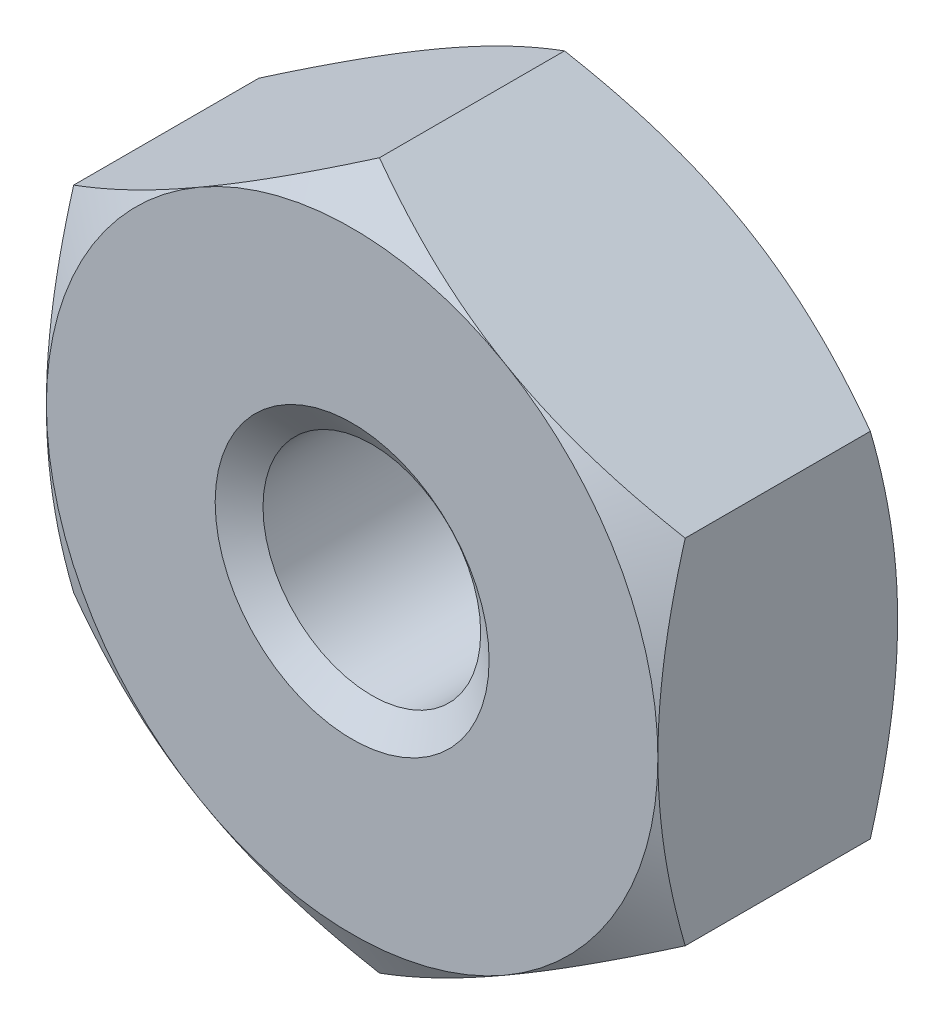
ISO-10303-21;
HEADER;
FILE_DESCRIPTION(('STEP AP214'),'2;1');
FILE_NAME('part.step','',(''),(''),'','','');
FILE_SCHEMA(('AUTOMOTIVE_DESIGN { 1 0 10303 214 1 1 1 1 }'));
ENDSEC;
DATA;
#1=APPLICATION_CONTEXT('core data for automotive mechanical design processes');
#2=APPLICATION_PROTOCOL_DEFINITION('international standard','automotive_design',2000,#1);
#3=PRODUCT_CONTEXT('',#1,'mechanical');
#4=PRODUCT('Part','Part','',(#3));
#5=PRODUCT_RELATED_PRODUCT_CATEGORY('part','',(#4));
#6=PRODUCT_DEFINITION_FORMATION('','',#4);
#7=PRODUCT_DEFINITION_CONTEXT('part definition',#1,'design');
#8=PRODUCT_DEFINITION('design','',#6,#7);
#9=PRODUCT_DEFINITION_SHAPE('','',#8);
#10=(LENGTH_UNIT() NAMED_UNIT(*) SI_UNIT(.MILLI.,.METRE.));
#11=(NAMED_UNIT(*) PLANE_ANGLE_UNIT() SI_UNIT($,.RADIAN.));
#12=(NAMED_UNIT(*) SI_UNIT($,.STERADIAN.) SOLID_ANGLE_UNIT());
#13=UNCERTAINTY_MEASURE_WITH_UNIT(LENGTH_MEASURE(1.E-05),#10,'distance_accuracy_value','');
#14=(GEOMETRIC_REPRESENTATION_CONTEXT(3) GLOBAL_UNCERTAINTY_ASSIGNED_CONTEXT((#13)) GLOBAL_UNIT_ASSIGNED_CONTEXT((#10,
#11,#12)) REPRESENTATION_CONTEXT('',''));
#15=CARTESIAN_POINT('',(0.,0.,0.));
#16=DIRECTION('',(0.,0.,1.));
#17=DIRECTION('',(1.,0.,0.));
#18=AXIS2_PLACEMENT_3D('',#15,#16,#17);
#19=CARTESIAN_POINT('',(0.,0.,-2.4892));
#20=DIRECTION('',(0.,0.,1.));
#21=DIRECTION('',(1.,0.,0.));
#22=AXIS2_PLACEMENT_3D('',#19,#20,#21);
#23=CYLINDRICAL_SURFACE('',#22,1.1303);
#24=CARTESIAN_POINT('',(0.,0.,-0.204530621911055));
#25=DIRECTION('',(0.,0.,1.));
#26=DIRECTION('',(1.,0.,0.));
#27=AXIS2_PLACEMENT_3D('',#24,#25,#26);
#28=CIRCLE('',#27,1.1303);
#29=CARTESIAN_POINT('',(1.1303,0.,-0.204530621911055));
#30=VERTEX_POINT('',#29);
#31=EDGE_CURVE('E178',#30,#30,#28,.F.);
#32=ORIENTED_EDGE('',*,*,#31,.F.);
#33=EDGE_LOOP('',(#32));
#34=FACE_BOUND('',#33,.T.);
#35=CARTESIAN_POINT('',(0.,0.,-2.25926937808894));
#36=DIRECTION('',(0.,0.,-1.));
#37=DIRECTION('',(-1.,0.,0.));
#38=AXIS2_PLACEMENT_3D('',#35,#36,#37);
#39=CIRCLE('',#38,1.1303);
#40=CARTESIAN_POINT('',(-1.1303,0.,-2.25926937808894));
#41=VERTEX_POINT('',#40);
#42=EDGE_CURVE('E43',#41,#41,#39,.F.);
#43=ORIENTED_EDGE('',*,*,#42,.F.);
#44=EDGE_LOOP('',(#43));
#45=FACE_BOUND('',#44,.T.);
#46=ADVANCED_FACE('F38',(#34,#45),#23,.F.);
#47=CARTESIAN_POINT('',(0.,3.66617420935413,-2.4892));
#48=DIRECTION('',(0.,0.,-1.));
#49=DIRECTION('',(-1.,0.,0.));
#50=AXIS2_PLACEMENT_3D('',#47,#48,#49);
#51=PLANE('',#50);
#52=CARTESIAN_POINT('',(0.,0.,-2.4892));
#53=DIRECTION('',(0.,0.,-1.));
#54=DIRECTION('',(-1.,0.,0.));
#55=AXIS2_PLACEMENT_3D('',#52,#53,#54);
#56=CIRCLE('',#55,3.175);
#57=CARTESIAN_POINT('',(-3.175,0.,-2.4892));
#58=VERTEX_POINT('',#57);
#59=CARTESIAN_POINT('',(-1.5875,-2.74963065701559,-2.4892));
#60=VERTEX_POINT('',#59);
#61=EDGE_CURVE('E174',#58,#60,#56,.F.);
#62=ORIENTED_EDGE('',*,*,#61,.F.);
#63=CARTESIAN_POINT('',(-1.58750000000001,2.74963065701559,-2.4892));
#64=VERTEX_POINT('',#63);
#65=EDGE_CURVE('E156',#64,#58,#56,.F.);
#66=ORIENTED_EDGE('',*,*,#65,.F.);
#67=CARTESIAN_POINT('',(1.5875,2.74963065701559,-2.4892));
#68=VERTEX_POINT('',#67);
#69=EDGE_CURVE('E173',#68,#64,#56,.F.);
#70=ORIENTED_EDGE('',*,*,#69,.F.);
#71=CARTESIAN_POINT('',(0.,0.,-2.4892));
#72=DIRECTION('',(0.,0.,1.));
#73=DIRECTION('',(1.,0.,0.));
#74=AXIS2_PLACEMENT_3D('',#71,#72,#73);
#75=CIRCLE('',#74,3.175);
#76=CARTESIAN_POINT('',(3.175,0.,-2.4892));
#77=VERTEX_POINT('',#76);
#78=EDGE_CURVE('E248',#77,#68,#75,.T.);
#79=ORIENTED_EDGE('',*,*,#78,.F.);
#80=CARTESIAN_POINT('',(1.58750000000001,-2.74963065701559,-2.4892));
#81=VERTEX_POINT('',#80);
#82=EDGE_CURVE('E380',#81,#77,#56,.F.);
#83=ORIENTED_EDGE('',*,*,#82,.F.);
#84=EDGE_CURVE('E401',#60,#81,#56,.F.);
#85=ORIENTED_EDGE('',*,*,#84,.F.);
#86=EDGE_LOOP('',(#62,#66,#70,#79,#83,#85));
#87=FACE_BOUND('',#86,.T.);
#88=CARTESIAN_POINT('',(0.,0.,-2.4892));
#89=DIRECTION('',(0.,0.,-1.));
#90=DIRECTION('',(-1.,0.,0.));
#91=AXIS2_PLACEMENT_3D('',#88,#89,#90);
#92=CIRCLE('',#91,1.4224);
#93=CARTESIAN_POINT('',(-1.4224,0.,-2.4892));
#94=VERTEX_POINT('',#93);
#95=EDGE_CURVE('E181',#94,#94,#92,.F.);
#96=ORIENTED_EDGE('',*,*,#95,.T.);
#97=EDGE_LOOP('',(#96));
#98=FACE_BOUND('',#97,.T.);
#99=ADVANCED_FACE('F253',(#87,#98),#51,.T.);
#100=CARTESIAN_POINT('',(0.,3.66617420935413,0.));
#101=DIRECTION('',(0.,0.,-1.));
#102=DIRECTION('',(-1.,0.,0.));
#103=AXIS2_PLACEMENT_3D('',#100,#101,#102);
#104=PLANE('',#103);
#105=CARTESIAN_POINT('',(0.,0.,0.));
#106=DIRECTION('',(0.,0.,-1.));
#107=DIRECTION('',(-1.,0.,0.));
#108=AXIS2_PLACEMENT_3D('',#105,#106,#107);
#109=CIRCLE('',#108,3.175);
#110=CARTESIAN_POINT('',(-3.175,0.,0.));
#111=VERTEX_POINT('',#110);
#112=CARTESIAN_POINT('',(-1.58750000000001,2.74963065701559,0.));
#113=VERTEX_POINT('',#112);
#114=EDGE_CURVE('E11',#111,#113,#109,.T.);
#115=ORIENTED_EDGE('',*,*,#114,.F.);
#116=CARTESIAN_POINT('',(-1.5875,-2.74963065701559,0.));
#117=VERTEX_POINT('',#116);
#118=EDGE_CURVE('E50',#117,#111,#109,.T.);
#119=ORIENTED_EDGE('',*,*,#118,.F.);
#120=CARTESIAN_POINT('',(1.58750000000001,-2.74963065701559,0.));
#121=VERTEX_POINT('',#120);
#122=EDGE_CURVE('E177',#121,#117,#109,.T.);
#123=ORIENTED_EDGE('',*,*,#122,.F.);
#124=CARTESIAN_POINT('',(3.175,0.,0.));
#125=VERTEX_POINT('',#124);
#126=EDGE_CURVE('E346',#125,#121,#109,.T.);
#127=ORIENTED_EDGE('',*,*,#126,.F.);
#128=CARTESIAN_POINT('',(0.,0.,0.));
#129=DIRECTION('',(0.,0.,1.));
#130=DIRECTION('',(1.,0.,0.));
#131=AXIS2_PLACEMENT_3D('',#128,#129,#130);
#132=CIRCLE('',#131,3.175);
#133=CARTESIAN_POINT('',(1.5875,2.74963065701559,0.));
#134=VERTEX_POINT('',#133);
#135=EDGE_CURVE('E132',#125,#134,#132,.T.);
#136=ORIENTED_EDGE('',*,*,#135,.T.);
#137=EDGE_CURVE('E48',#113,#134,#109,.T.);
#138=ORIENTED_EDGE('',*,*,#137,.F.);
#139=EDGE_LOOP('',(#115,#119,#123,#127,#136,#138));
#140=FACE_BOUND('',#139,.T.);
#141=CARTESIAN_POINT('',(0.,0.,0.));
#142=DIRECTION('',(0.,0.,1.));
#143=DIRECTION('',(1.,0.,0.));
#144=AXIS2_PLACEMENT_3D('',#141,#142,#143);
#145=CIRCLE('',#144,1.4224);
#146=CARTESIAN_POINT('',(1.4224,0.,0.));
#147=VERTEX_POINT('',#146);
#148=EDGE_CURVE('E180',#147,#147,#145,.T.);
#149=ORIENTED_EDGE('',*,*,#148,.F.);
#150=EDGE_LOOP('',(#149));
#151=FACE_BOUND('',#150,.T.);
#152=ADVANCED_FACE('F305',(#140,#151),#104,.F.);
#153=CARTESIAN_POINT('',(0.,3.66617420935413,-2.4892));
#154=DIRECTION('',(-0.500000000000003,0.866025403784437,0.));
#155=DIRECTION('',(-0.866025403784437,-0.500000000000003,0.));
#156=AXIS2_PLACEMENT_3D('',#153,#154,#155);
#157=PLANE('',#156);
#158=DIRECTION('',(0.,0.,1.));
#159=VECTOR('',#158,1.);
#160=CARTESIAN_POINT('',(-3.175,1.83308710467705,-2.4892));
#161=LINE('',#160,#159);
#162=CARTESIAN_POINT('',(-3.175,1.83308710467707,-2.20562043801039));
#163=VERTEX_POINT('',#162);
#164=CARTESIAN_POINT('',(-3.175,1.83308710467705,-0.283579561989604));
#165=VERTEX_POINT('',#164);
#166=EDGE_CURVE('E168',#163,#165,#161,.T.);
#167=ORIENTED_EDGE('',*,*,#166,.T.);
#168=CARTESIAN_POINT('',(-3.1752,1.83297163462322,-0.283646231805777));
#169=CARTESIAN_POINT('',(-3.03567460326018,1.91352665998974,-0.237119934023206));
#170=CARTESIAN_POINT('',(-2.89494483272887,1.99477703088899,-0.194805864908322));
#171=CARTESIAN_POINT('',(-2.61104837470026,2.15868472735379,-0.120946008708286));
#172=CARTESIAN_POINT('',(-2.46787664251628,2.24134496547055,-0.0894263509090417));
#173=CARTESIAN_POINT('',(-2.18330753500984,2.40564101629245,-0.0403611049832706));
#174=CARTESIAN_POINT('',(-2.0419539457708,2.48725154909053,-0.0224889669031259));
#175=CARTESIAN_POINT('',(-1.7585816022433,2.65085664790703,-0.00115281403229668));
#176=CARTESIAN_POINT('',(-1.61656387803407,2.73285061920892,0.00232886836810178));
#177=CARTESIAN_POINT('',(-1.35119263453263,2.88606277807967,-0.0049117007222132));
#178=CARTESIAN_POINT('',(-1.22779940341379,2.95730389328231,-0.0138561461436312));
#179=CARTESIAN_POINT('',(-0.981816852669884,3.09932198517026,-0.0422055763684448));
#180=CARTESIAN_POINT('',(-0.859228383940738,3.17009847059057,-0.0616202467099072));
#181=CARTESIAN_POINT('',(-0.612738605574498,3.31240941048281,-0.110155730811224));
#182=CARTESIAN_POINT('',(-0.488868495421443,3.38392585192423,-0.139482298472807));
#183=CARTESIAN_POINT('',(-0.242975839646996,3.52589204292736,-0.206042193662161));
#184=CARTESIAN_POINT('',(-0.120950143425915,3.59634361148865,-0.243259880449917));
#185=CARTESIAN_POINT('',(0.000199999999997795,3.66628967940797,-0.283646231805782));
#186=B_SPLINE_CURVE_WITH_KNOTS('',3,(#168,#169,#170,#171,#172,#173,#174,#175,#176,#177,#178,
#179,#180,#181,#182,#183,#184,#185),.UNSPECIFIED.,.F.,.F.,(4,2,2,2,2,2,2,2,4),(0.,
0.503278731073368,1.00776724301492,1.49976968502821,1.99116790059651,2.41904879402149,
2.84732618162394,3.28510386250598,3.72202181665389),.UNSPECIFIED.);
#187=EDGE_CURVE('E137',#165,#113,#186,.T.);
#188=ORIENTED_EDGE('',*,*,#187,.T.);
#189=CARTESIAN_POINT('',(0.,3.66617420935413,-0.283579561989608));
#190=VERTEX_POINT('',#189);
#191=EDGE_CURVE('E57',#113,#190,#186,.T.);
#192=ORIENTED_EDGE('',*,*,#191,.T.);
#193=DIRECTION('',(0.,0.,1.));
#194=VECTOR('',#193,1.);
#195=CARTESIAN_POINT('',(0.,3.66617420935413,-2.4892));
#196=LINE('',#195,#194);
#197=CARTESIAN_POINT('',(0.,3.66617420935413,-2.20562043801039));
#198=VERTEX_POINT('',#197);
#199=EDGE_CURVE('E153',#198,#190,#196,.T.);
#200=ORIENTED_EDGE('',*,*,#199,.F.);
#201=CARTESIAN_POINT('',(-3.1752,1.83297163462322,-2.20555376819422));
#202=CARTESIAN_POINT('',(-3.03567460326018,1.91352665998974,-2.25208006597679));
#203=CARTESIAN_POINT('',(-2.89494483272887,1.99477703088899,-2.29439413509168));
#204=CARTESIAN_POINT('',(-2.61104837470026,2.15868472735379,-2.36825399129171));
#205=CARTESIAN_POINT('',(-2.46787664251628,2.24134496547055,-2.39977364909096));
#206=CARTESIAN_POINT('',(-2.18330753500984,2.40564101629245,-2.44883889501673));
#207=CARTESIAN_POINT('',(-2.0419539457708,2.48725154909053,-2.46671103309687));
#208=CARTESIAN_POINT('',(-1.7585816022433,2.65085664790703,-2.4880471859677));
#209=CARTESIAN_POINT('',(-1.61656387803408,2.73285061920892,-2.4915288683681));
#210=CARTESIAN_POINT('',(-1.35119263453263,2.88606277807967,-2.48428829927779));
#211=CARTESIAN_POINT('',(-1.22779940341379,2.95730389328231,-2.47534385385637));
#212=CARTESIAN_POINT('',(-0.981816852669885,3.09932198517026,-2.44699442363156));
#213=CARTESIAN_POINT('',(-0.859228383940739,3.17009847059057,-2.42757975329009));
#214=CARTESIAN_POINT('',(-0.612738605574499,3.31240941048281,-2.37904426918878));
#215=CARTESIAN_POINT('',(-0.488868495421443,3.38392585192423,-2.34971770152719));
#216=CARTESIAN_POINT('',(-0.242975839646997,3.52589204292736,-2.28315780633784));
#217=CARTESIAN_POINT('',(-0.120950143425915,3.59634361148865,-2.24594011955008));
#218=CARTESIAN_POINT('',(0.000199999999997508,3.66628967940797,-2.20555376819422));
#219=B_SPLINE_CURVE_WITH_KNOTS('',3,(#201,#202,#203,#204,#205,#206,#207,#208,#209,#210,#211,
#212,#213,#214,#215,#216,#217,#218),.UNSPECIFIED.,.F.,.F.,(4,2,2,2,2,2,2,2,4),(0.,
0.503278731073368,1.00776724301492,1.49976968502821,1.99116790059651,2.41904879402149,
2.84732618162394,3.28510386250597,3.72202181665389),.UNSPECIFIED.);
#220=EDGE_CURVE('E171',#64,#198,#219,.T.);
#221=ORIENTED_EDGE('',*,*,#220,.F.);
#222=EDGE_CURVE('E263',#163,#64,#219,.T.);
#223=ORIENTED_EDGE('',*,*,#222,.F.);
#224=EDGE_LOOP('',(#167,#188,#192,#200,#221,#223));
#225=FACE_BOUND('',#224,.T.);
#226=ADVANCED_FACE('F40',(#225),#157,.T.);
#227=CARTESIAN_POINT('',(3.175,1.83308710467706,-2.4892));
#228=DIRECTION('',(0.500000000000001,0.866025403784438,0.));
#229=DIRECTION('',(-0.866025403784438,0.500000000000001,0.));
#230=AXIS2_PLACEMENT_3D('',#227,#228,#229);
#231=PLANE('',#230);
#232=ORIENTED_EDGE('',*,*,#199,.T.);
#233=CARTESIAN_POINT('',(-0.000200000000002592,3.66628967940797,-0.283646231805782));
#234=CARTESIAN_POINT('',(0.139325396739816,3.58573465404144,-0.237119934023211));
#235=CARTESIAN_POINT('',(0.280055167271126,3.5044842831422,-0.194805864908326));
#236=CARTESIAN_POINT('',(0.56395162529974,3.34057658667739,-0.120946008708289));
#237=CARTESIAN_POINT('',(0.707123357483716,3.25791634856063,-0.0894263509090447));
#238=CARTESIAN_POINT('',(0.991692464990165,3.09362029773873,-0.0403611049832727));
#239=CARTESIAN_POINT('',(1.1330460542292,3.01200976494065,-0.0224889669031276));
#240=CARTESIAN_POINT('',(1.41641839775671,2.84840466612415,-0.00115281403229755));
#241=CARTESIAN_POINT('',(1.55843612196593,2.76641069482226,0.00232886836810127));
#242=CARTESIAN_POINT('',(1.82380736546737,2.61319853595151,-0.00491170072221298));
#243=CARTESIAN_POINT('',(1.94720059658621,2.54195742074887,-0.0138561461436305));
#244=CARTESIAN_POINT('',(2.19318314733012,2.39993932886093,-0.0422055763684434));
#245=CARTESIAN_POINT('',(2.31577161605926,2.32916284344061,-0.0616202467099056));
#246=CARTESIAN_POINT('',(2.5622613944255,2.18685190354837,-0.110155730811222));
#247=CARTESIAN_POINT('',(2.68613150457856,2.11533546210696,-0.139482298472804));
#248=CARTESIAN_POINT('',(2.932024160353,1.97336927110383,-0.206042193662157));
#249=CARTESIAN_POINT('',(3.05404985657409,1.90291770254253,-0.243259880449913));
#250=CARTESIAN_POINT('',(3.1752,1.83297163462322,-0.283646231805778));
#251=B_SPLINE_CURVE_WITH_KNOTS('',3,(#233,#234,#235,#236,#237,#238,#239,#240,#241,#242,#243,
#244,#245,#246,#247,#248,#249,#250),.UNSPECIFIED.,.F.,.F.,(4,2,2,2,2,2,2,2,4),(0.,
0.503278731073369,1.00776724301492,1.49976968502821,1.99116790059651,2.41904879402149,
2.84732618162394,3.28510386250598,3.72202181665389),.UNSPECIFIED.);
#252=EDGE_CURVE('E147',#190,#134,#251,.T.);
#253=ORIENTED_EDGE('',*,*,#252,.T.);
#254=CARTESIAN_POINT('',(3.175,1.83308710467707,-0.283579561989608));
#255=VERTEX_POINT('',#254);
#256=EDGE_CURVE('E64',#134,#255,#251,.T.);
#257=ORIENTED_EDGE('',*,*,#256,.T.);
#258=DIRECTION('',(0.,0.,1.));
#259=VECTOR('',#258,1.);
#260=CARTESIAN_POINT('',(3.175,1.83308710467706,-2.4892));
#261=LINE('',#260,#259);
#262=CARTESIAN_POINT('',(3.175,1.83308710467707,-2.20562043801039));
#263=VERTEX_POINT('',#262);
#264=EDGE_CURVE('E146',#263,#255,#261,.T.);
#265=ORIENTED_EDGE('',*,*,#264,.F.);
#266=CARTESIAN_POINT('',(-0.000200000000002578,3.66628967940797,-2.20555376819422));
#267=CARTESIAN_POINT('',(0.139325396739816,3.58573465404144,-2.25208006597679));
#268=CARTESIAN_POINT('',(0.280055167271126,3.5044842831422,-2.29439413509167));
#269=CARTESIAN_POINT('',(0.56395162529974,3.34057658667739,-2.36825399129171));
#270=CARTESIAN_POINT('',(0.707123357483716,3.25791634856063,-2.39977364909096));
#271=CARTESIAN_POINT('',(0.991692464990165,3.09362029773873,-2.44883889501673));
#272=CARTESIAN_POINT('',(1.1330460542292,3.01200976494066,-2.46671103309687));
#273=CARTESIAN_POINT('',(1.4164183977567,2.84840466612415,-2.4880471859677));
#274=CARTESIAN_POINT('',(1.55843612196593,2.76641069482226,-2.4915288683681));
#275=CARTESIAN_POINT('',(1.82380736546737,2.61319853595151,-2.48428829927779));
#276=CARTESIAN_POINT('',(1.94720059658621,2.54195742074887,-2.47534385385637));
#277=CARTESIAN_POINT('',(2.19318314733012,2.39993932886093,-2.44699442363156));
#278=CARTESIAN_POINT('',(2.31577161605926,2.32916284344061,-2.42757975329009));
#279=CARTESIAN_POINT('',(2.5622613944255,2.18685190354837,-2.37904426918878));
#280=CARTESIAN_POINT('',(2.68613150457856,2.11533546210696,-2.3497177015272));
#281=CARTESIAN_POINT('',(2.932024160353,1.97336927110383,-2.28315780633784));
#282=CARTESIAN_POINT('',(3.05404985657409,1.90291770254253,-2.24594011955009));
#283=CARTESIAN_POINT('',(3.1752,1.83297163462322,-2.20555376819422));
#284=B_SPLINE_CURVE_WITH_KNOTS('',3,(#266,#267,#268,#269,#270,#271,#272,#273,#274,#275,#276,
#277,#278,#279,#280,#281,#282,#283),.UNSPECIFIED.,.F.,.F.,(4,2,2,2,2,2,2,2,4),(0.,
0.503278731073369,1.00776724301492,1.49976968502821,1.99116790059651,2.41904879402149,
2.84732618162394,3.28510386250597,3.72202181665389),.UNSPECIFIED.);
#285=EDGE_CURVE('E257',#68,#263,#284,.T.);
#286=ORIENTED_EDGE('',*,*,#285,.F.);
#287=EDGE_CURVE('E262',#198,#68,#284,.T.);
#288=ORIENTED_EDGE('',*,*,#287,.F.);
#289=EDGE_LOOP('',(#232,#253,#257,#265,#286,#288));
#290=FACE_BOUND('',#289,.T.);
#291=ADVANCED_FACE('F144',(#290),#231,.T.);
#292=CARTESIAN_POINT('',(3.175,1.83308710467706,-2.4892));
#293=DIRECTION('',(-1.,0.,0.));
#294=DIRECTION('',(0.,0.,1.));
#295=AXIS2_PLACEMENT_3D('',#292,#293,#294);
#296=PLANE('',#295);
#297=CARTESIAN_POINT('',(3.175,-4.8616171420299,-1.51932228935976));
#298=CARTESIAN_POINT('',(3.175,-4.72221668774449,-1.45195628992123));
#299=CARTESIAN_POINT('',(3.175,-4.58248664475634,-1.38525996427212));
#300=CARTESIAN_POINT('',(3.175,-4.30218917292502,-1.25358933527025));
#301=CARTESIAN_POINT('',(3.175,-4.16162160419068,-1.18861533006649));
#302=CARTESIAN_POINT('',(3.175,-3.87871153776028,-1.06042973005273));
#303=CARTESIAN_POINT('',(3.175,-3.73636348618431,-0.997230348581289));
#304=CARTESIAN_POINT('',(3.175,-3.4504974070564,-0.873546152177363));
#305=CARTESIAN_POINT('',(3.175,-3.30697944095183,-0.813061195746994));
#306=CARTESIAN_POINT('',(3.175,-3.01676360978826,-0.694809578750527));
#307=CARTESIAN_POINT('',(3.175,-2.87004833678074,-0.637085406846329));
#308=CARTESIAN_POINT('',(3.175,-2.57488727143506,-0.52615800832404));
#309=CARTESIAN_POINT('',(3.175,-2.42644128864792,-0.472955284693414));
#310=CARTESIAN_POINT('',(3.175,-2.12788752613931,-0.372500325317013));
#311=CARTESIAN_POINT('',(3.175,-1.97778404697074,-0.325235438859671));
#312=CARTESIAN_POINT('',(3.175,-1.67544317117207,-0.238191164257202));
#313=CARTESIAN_POINT('',(3.175,-1.52320646578688,-0.198409408930922));
#314=CARTESIAN_POINT('',(3.175,-1.21649515954196,-0.12826269349477));
#315=CARTESIAN_POINT('',(3.175,-1.06201997425122,-0.0979002407280034));
#316=CARTESIAN_POINT('',(3.175,-0.751207163661342,-0.0486364247633595));
#317=CARTESIAN_POINT('',(3.175,-0.594869536715698,-0.0297350716985354));
#318=CARTESIAN_POINT('',(3.175,-0.282140016767182,-0.00506556418736419));
#319=CARTESIAN_POINT('',(3.175,-0.125754853180874,0.000785733729077507));
#320=CARTESIAN_POINT('',(3.175,0.186905967950925,-0.000955727684993067));
#321=CARTESIAN_POINT('',(3.175,0.34318164338531,-0.00854499720968375));
#322=CARTESIAN_POINT('',(3.175,0.61004500421025,-0.0324474955995366));
#323=CARTESIAN_POINT('',(3.175,0.720927103340566,-0.0456480037348523));
#324=CARTESIAN_POINT('',(3.175,0.941834770691505,-0.0779568944626853));
#325=CARTESIAN_POINT('',(3.175,1.05186020102054,-0.0970662087901405));
#326=CARTESIAN_POINT('',(3.175,1.38056179828294,-0.162254462566744));
#327=CARTESIAN_POINT('',(3.175,1.59769723107173,-0.216176928599964));
#328=CARTESIAN_POINT('',(3.175,1.92260738330278,-0.309178610208029));
#329=CARTESIAN_POINT('',(3.175,2.03207569486971,-0.342672941312984));
#330=CARTESIAN_POINT('',(3.175,2.24986976286739,-0.412975885555784));
#331=CARTESIAN_POINT('',(3.175,2.35819625057448,-0.44978221272336));
#332=CARTESIAN_POINT('',(3.175,2.57325368409845,-0.52594327372435));
#333=CARTESIAN_POINT('',(3.175,2.67999017870302,-0.565282497316839));
#334=CARTESIAN_POINT('',(3.175,2.89263503540125,-0.646269943321368));
#335=CARTESIAN_POINT('',(3.175,2.99854304277513,-0.687919098952172));
#336=CARTESIAN_POINT('',(3.175,3.1040681107068,-0.730495273942545));
#337=B_SPLINE_CURVE_WITH_KNOTS('',3,(#297,#298,#299,#300,#301,#302,#303,#304,#305,#306,#307,
#308,#309,#310,#311,#312,#313,#314,#315,#316,#317,#318,#319,#320,#321,#322,#323,#324,#325,#326,
#327,#328,#329,#330,#331,#332,#333,#334,#335,#336),.UNSPECIFIED.,.F.,.F.,(4,2,2,2,2,2,2,2,2,2,2,
2,2,2,2,2,2,2,2,4),(0.,0.46448011032249,0.929040108038168,1.39625859500254,1.86345269838581,
2.33638249541752,2.80936483473484,3.2813217385372,3.7531290935448,4.22506193235102,
4.69699518840458,5.16591300646641,5.63470908917535,5.96954086780257,6.30442547160104,
6.97469308766864,7.3180994250629,7.66127053211061,8.00251004161232,8.34388843151021),.UNSPECIFIED.);
#338=CARTESIAN_POINT('',(3.175,-1.83308710467707,-0.283579561989608));
#339=VERTEX_POINT('',#338);
#340=EDGE_CURVE('E139',#339,#125,#337,.T.);
#341=ORIENTED_EDGE('',*,*,#340,.F.);
#342=DIRECTION('',(0.,0.,1.));
#343=VECTOR('',#342,1.);
#344=CARTESIAN_POINT('',(3.175,-1.83308710467707,-2.4892));
#345=LINE('',#344,#343);
#346=CARTESIAN_POINT('',(3.175,-1.83308710467707,-2.20562043801039));
#347=VERTEX_POINT('',#346);
#348=EDGE_CURVE('E154',#347,#339,#345,.T.);
#349=ORIENTED_EDGE('',*,*,#348,.F.);
#350=CARTESIAN_POINT('',(3.175,-4.86161714202989,-0.969877710640244));
#351=CARTESIAN_POINT('',(3.175,-4.72221668774449,-1.03724371007878));
#352=CARTESIAN_POINT('',(3.175,-4.58248664475633,-1.10394003572788));
#353=CARTESIAN_POINT('',(3.175,-4.30218917292502,-1.23561066472975));
#354=CARTESIAN_POINT('',(3.175,-4.16162160419068,-1.30058466993351));
#355=CARTESIAN_POINT('',(3.175,-3.87871153776028,-1.42877026994727));
#356=CARTESIAN_POINT('',(3.175,-3.73636348618431,-1.49196965141871));
#357=CARTESIAN_POINT('',(3.175,-3.4504974070564,-1.61565384782264));
#358=CARTESIAN_POINT('',(3.175,-3.30697944095183,-1.67613880425301));
#359=CARTESIAN_POINT('',(3.175,-3.01676360978826,-1.79439042124948));
#360=CARTESIAN_POINT('',(3.175,-2.87004833678074,-1.85211459315367));
#361=CARTESIAN_POINT('',(3.175,-2.57488727143506,-1.96304199167596));
#362=CARTESIAN_POINT('',(3.175,-2.42644128864792,-2.01624471530659));
#363=CARTESIAN_POINT('',(3.175,-2.12788752613931,-2.11669967468299));
#364=CARTESIAN_POINT('',(3.175,-1.97778404697074,-2.16396456114033));
#365=CARTESIAN_POINT('',(3.175,-1.67544317117207,-2.2510088357428));
#366=CARTESIAN_POINT('',(3.175,-1.52320646578688,-2.29079059106908));
#367=CARTESIAN_POINT('',(3.175,-1.21649515954197,-2.36093730650523));
#368=CARTESIAN_POINT('',(3.175,-1.06201997425122,-2.391299759272));
#369=CARTESIAN_POINT('',(3.175,-0.751207163661344,-2.44056357523664));
#370=CARTESIAN_POINT('',(3.175,-0.5948695367157,-2.45946492830147));
#371=CARTESIAN_POINT('',(3.175,-0.282140016767183,-2.48413443581264));
#372=CARTESIAN_POINT('',(3.175,-0.125754853180875,-2.48998573372908));
#373=CARTESIAN_POINT('',(3.175,0.186905967950924,-2.48824427231501));
#374=CARTESIAN_POINT('',(3.175,0.343181643385309,-2.48065500279032));
#375=CARTESIAN_POINT('',(3.175,0.61004500421025,-2.45675250440046));
#376=CARTESIAN_POINT('',(3.175,0.720927103340565,-2.44355199626515));
#377=CARTESIAN_POINT('',(3.175,0.941834770691505,-2.41124310553732));
#378=CARTESIAN_POINT('',(3.175,1.05186020102054,-2.39213379120986));
#379=CARTESIAN_POINT('',(3.175,1.38056179828294,-2.32694553743326));
#380=CARTESIAN_POINT('',(3.175,1.59769723107173,-2.27302307140004));
#381=CARTESIAN_POINT('',(3.175,1.92260738330278,-2.18002138979197));
#382=CARTESIAN_POINT('',(3.175,2.03207569486971,-2.14652705868702));
#383=CARTESIAN_POINT('',(3.175,2.24986976286739,-2.07622411444422));
#384=CARTESIAN_POINT('',(3.175,2.35819625057448,-2.03941778727664));
#385=CARTESIAN_POINT('',(3.175,2.57325368409845,-1.96325672627565));
#386=CARTESIAN_POINT('',(3.175,2.67999017870302,-1.92391750268316));
#387=CARTESIAN_POINT('',(3.175,2.89263503540125,-1.84293005667863));
#388=CARTESIAN_POINT('',(3.175,2.99854304277513,-1.80128090104783));
#389=CARTESIAN_POINT('',(3.175,3.1040681107068,-1.75870472605745));
#390=B_SPLINE_CURVE_WITH_KNOTS('',3,(#350,#351,#352,#353,#354,#355,#356,#357,#358,#359,#360,
#361,#362,#363,#364,#365,#366,#367,#368,#369,#370,#371,#372,#373,#374,#375,#376,#377,#378,#379,
#380,#381,#382,#383,#384,#385,#386,#387,#388,#389),.UNSPECIFIED.,.F.,.F.,(4,2,2,2,2,2,2,2,2,2,2,
2,2,2,2,2,2,2,2,4),(0.,0.464480110322489,0.929040108038167,1.39625859500254,1.86345269838581,
2.33638249541752,2.80936483473484,3.2813217385372,3.7531290935448,4.22506193235102,
4.69699518840457,5.16591300646641,5.63470908917534,5.96954086780257,6.30442547160103,
6.97469308766864,7.3180994250629,7.66127053211061,8.00251004161232,8.34388843151022),.UNSPECIFIED.);
#391=EDGE_CURVE('E269',#347,#77,#390,.T.);
#392=ORIENTED_EDGE('',*,*,#391,.T.);
#393=EDGE_CURVE('E152',#77,#263,#390,.T.);
#394=ORIENTED_EDGE('',*,*,#393,.T.);
#395=ORIENTED_EDGE('',*,*,#264,.T.);
#396=EDGE_CURVE('E129',#125,#255,#337,.T.);
#397=ORIENTED_EDGE('',*,*,#396,.F.);
#398=EDGE_LOOP('',(#341,#349,#392,#394,#395,#397));
#399=FACE_BOUND('',#398,.T.);
#400=ADVANCED_FACE('F150',(#399),#296,.F.);
#401=CARTESIAN_POINT('',(0.,-3.66617420935414,-2.4892));
#402=DIRECTION('',(0.500000000000003,-0.866025403784437,0.));
#403=DIRECTION('',(0.866025403784437,0.500000000000003,0.));
#404=AXIS2_PLACEMENT_3D('',#401,#402,#403);
#405=PLANE('',#404);
#406=ORIENTED_EDGE('',*,*,#348,.T.);
#407=CARTESIAN_POINT('',(3.1752,-1.83297163462323,-0.283646231805781));
#408=CARTESIAN_POINT('',(3.03567460326018,-1.91352665998975,-0.23711993402321));
#409=CARTESIAN_POINT('',(2.89494483272887,-1.994777030889,-0.194805864908325));
#410=CARTESIAN_POINT('',(2.61104837470026,-2.1586847273538,-0.12094600870829));
#411=CARTESIAN_POINT('',(2.46787664251628,-2.24134496547057,-0.089426350909046));
#412=CARTESIAN_POINT('',(2.18330753500983,-2.40564101629247,-0.0403611049832756));
#413=CARTESIAN_POINT('',(2.0419539457708,-2.48725154909054,-0.0224889669031313));
#414=CARTESIAN_POINT('',(1.75858160224329,-2.65085664790705,-0.00115281403230271));
#415=CARTESIAN_POINT('',(1.61656387803407,-2.73285061920894,0.00232886836809552));
#416=CARTESIAN_POINT('',(1.35119263453262,-2.88606277807969,-0.00491170072221993));
#417=CARTESIAN_POINT('',(1.22779940341379,-2.95730389328232,-0.0138561461436381));
#418=CARTESIAN_POINT('',(0.981816852669881,-3.09932198517027,-0.0422055763684521));
#419=CARTESIAN_POINT('',(0.859228383940735,-3.17009847059059,-0.0616202467099147));
#420=CARTESIAN_POINT('',(0.612738605574495,-3.31240941048283,-0.110155730811232));
#421=CARTESIAN_POINT('',(0.48886849542144,-3.38392585192424,-0.139482298472814));
#422=CARTESIAN_POINT('',(0.242975839646995,-3.52589204292737,-0.206042193662168));
#423=CARTESIAN_POINT('',(0.120950143425913,-3.59634361148867,-0.243259880449925));
#424=CARTESIAN_POINT('',(-0.000199999999999131,-3.66628967940798,-0.283646231805789));
#425=B_SPLINE_CURVE_WITH_KNOTS('',3,(#407,#408,#409,#410,#411,#412,#413,#414,#415,#416,#417,
#418,#419,#420,#421,#422,#423,#424),.UNSPECIFIED.,.F.,.F.,(4,2,2,2,2,2,2,2,4),(0.,
0.503278731073368,1.00776724301492,1.49976968502821,1.99116790059651,2.41904879402149,
2.84732618162394,3.28510386250597,3.72202181665389),.UNSPECIFIED.);
#426=EDGE_CURVE('E349',#339,#121,#425,.T.);
#427=ORIENTED_EDGE('',*,*,#426,.T.);
#428=CARTESIAN_POINT('',(0.,-3.66617420935413,-0.283579561989608));
#429=VERTEX_POINT('',#428);
#430=EDGE_CURVE('E229',#121,#429,#425,.T.);
#431=ORIENTED_EDGE('',*,*,#430,.T.);
#432=DIRECTION('',(0.,0.,1.));
#433=VECTOR('',#432,1.);
#434=CARTESIAN_POINT('',(0.,-3.66617420935414,-2.4892));
#435=LINE('',#434,#433);
#436=CARTESIAN_POINT('',(0.,-3.66617420935413,-2.20562043801039));
#437=VERTEX_POINT('',#436);
#438=EDGE_CURVE('E159',#437,#429,#435,.T.);
#439=ORIENTED_EDGE('',*,*,#438,.F.);
#440=CARTESIAN_POINT('',(3.1752,-1.83297163462323,-2.20555376819422));
#441=CARTESIAN_POINT('',(3.03567460326018,-1.91352665998975,-2.25208006597679));
#442=CARTESIAN_POINT('',(2.89494483272887,-1.994777030889,-2.29439413509168));
#443=CARTESIAN_POINT('',(2.61104837470026,-2.1586847273538,-2.36825399129171));
#444=CARTESIAN_POINT('',(2.46787664251628,-2.24134496547057,-2.39977364909095));
#445=CARTESIAN_POINT('',(2.18330753500983,-2.40564101629247,-2.44883889501672));
#446=CARTESIAN_POINT('',(2.0419539457708,-2.48725154909054,-2.46671103309687));
#447=CARTESIAN_POINT('',(1.75858160224329,-2.65085664790705,-2.4880471859677));
#448=CARTESIAN_POINT('',(1.61656387803407,-2.73285061920894,-2.4915288683681));
#449=CARTESIAN_POINT('',(1.35119263453262,-2.88606277807969,-2.48428829927778));
#450=CARTESIAN_POINT('',(1.22779940341379,-2.95730389328232,-2.47534385385636));
#451=CARTESIAN_POINT('',(0.981816852669881,-3.09932198517027,-2.44699442363155));
#452=CARTESIAN_POINT('',(0.859228383940735,-3.17009847059059,-2.42757975329009));
#453=CARTESIAN_POINT('',(0.612738605574495,-3.31240941048283,-2.37904426918877));
#454=CARTESIAN_POINT('',(0.48886849542144,-3.38392585192424,-2.34971770152719));
#455=CARTESIAN_POINT('',(0.242975839646994,-3.52589204292737,-2.28315780633783));
#456=CARTESIAN_POINT('',(0.120950143425913,-3.59634361148867,-2.24594011955008));
#457=CARTESIAN_POINT('',(-0.000199999999999717,-3.66628967940798,-2.20555376819421));
#458=B_SPLINE_CURVE_WITH_KNOTS('',3,(#440,#441,#442,#443,#444,#445,#446,#447,#448,#449,#450,
#451,#452,#453,#454,#455,#456,#457),.UNSPECIFIED.,.F.,.F.,(4,2,2,2,2,2,2,2,4),(0.,
0.503278731073368,1.00776724301492,1.49976968502821,1.99116790059651,2.41904879402149,
2.84732618162394,3.28510386250597,3.72202181665389),.UNSPECIFIED.);
#459=EDGE_CURVE('E275',#81,#437,#458,.T.);
#460=ORIENTED_EDGE('',*,*,#459,.F.);
#461=EDGE_CURVE('E274',#347,#81,#458,.T.);
#462=ORIENTED_EDGE('',*,*,#461,.F.);
#463=EDGE_LOOP('',(#406,#427,#431,#439,#460,#462));
#464=FACE_BOUND('',#463,.T.);
#465=ADVANCED_FACE('F285',(#464),#405,.T.);
#466=CARTESIAN_POINT('',(-3.175,-1.83308710467707,-2.4892));
#467=DIRECTION('',(-0.500000000000001,-0.866025403784438,0.));
#468=DIRECTION('',(0.866025403784438,-0.500000000000001,0.));
#469=AXIS2_PLACEMENT_3D('',#466,#467,#468);
#470=PLANE('',#469);
#471=ORIENTED_EDGE('',*,*,#438,.T.);
#472=CARTESIAN_POINT('',(0.000200000000000635,-3.66628967940798,-0.28364623180579));
#473=CARTESIAN_POINT('',(-0.139325396739819,-3.58573465404145,-0.237119934023219));
#474=CARTESIAN_POINT('',(-0.280055167271129,-3.50448428314221,-0.194805864908333));
#475=CARTESIAN_POINT('',(-0.563951625299744,-3.34057658667741,-0.120946008708296));
#476=CARTESIAN_POINT('',(-0.70712335748372,-3.25791634856064,-0.0894263509090518));
#477=CARTESIAN_POINT('',(-0.99169246499017,-3.09362029773874,-0.0403611049832797));
#478=CARTESIAN_POINT('',(-1.1330460542292,-3.01200976494067,-0.0224889669031346));
#479=CARTESIAN_POINT('',(-1.41641839775671,-2.84840466612416,-0.00115281403230467));
#480=CARTESIAN_POINT('',(-1.55843612196593,-2.76641069482227,0.0023288683680941));
#481=CARTESIAN_POINT('',(-1.82380736546738,-2.61319853595152,-0.0049117007222203));
#482=CARTESIAN_POINT('',(-1.94720059658622,-2.54195742074889,-0.0138561461436378));
#483=CARTESIAN_POINT('',(-2.19318314733012,-2.39993932886094,-0.0422055763684505));
#484=CARTESIAN_POINT('',(-2.31577161605927,-2.32916284344062,-0.0616202467099124));
#485=CARTESIAN_POINT('',(-2.56226139442551,-2.18685190354838,-0.110155730811228));
#486=CARTESIAN_POINT('',(-2.68613150457856,-2.11533546210697,-0.13948229847281));
#487=CARTESIAN_POINT('',(-2.93202416035301,-1.97336927110384,-0.206042193662163));
#488=CARTESIAN_POINT('',(-3.05404985657409,-1.90291770254255,-0.243259880449918));
#489=CARTESIAN_POINT('',(-3.1752,-1.83297163462324,-0.283646231805783));
#490=B_SPLINE_CURVE_WITH_KNOTS('',3,(#472,#473,#474,#475,#476,#477,#478,#479,#480,#481,#482,
#483,#484,#485,#486,#487,#488,#489),.UNSPECIFIED.,.F.,.F.,(4,2,2,2,2,2,2,2,4),(0.,
0.503278731073371,1.00776724301493,1.49976968502822,1.99116790059652,2.41904879402149,
2.84732618162395,3.28510386250598,3.72202181665389),.UNSPECIFIED.);
#491=EDGE_CURVE('E352',#429,#117,#490,.T.);
#492=ORIENTED_EDGE('',*,*,#491,.T.);
#493=CARTESIAN_POINT('',(-3.175,-1.83308710467707,-0.283579561989608));
#494=VERTEX_POINT('',#493);
#495=EDGE_CURVE('E203',#117,#494,#490,.T.);
#496=ORIENTED_EDGE('',*,*,#495,.T.);
#497=DIRECTION('',(0.,0.,1.));
#498=VECTOR('',#497,1.);
#499=CARTESIAN_POINT('',(-3.175,-1.83308710467707,-2.4892));
#500=LINE('',#499,#498);
#501=CARTESIAN_POINT('',(-3.175,-1.83308710467707,-2.20562043801039));
#502=VERTEX_POINT('',#501);
#503=EDGE_CURVE('E165',#502,#494,#500,.T.);
#504=ORIENTED_EDGE('',*,*,#503,.F.);
#505=CARTESIAN_POINT('',(0.000200000000000635,-3.66628967940798,-2.20555376819421));
#506=CARTESIAN_POINT('',(-0.139325396739819,-3.58573465404146,-2.25208006597678));
#507=CARTESIAN_POINT('',(-0.280055167271129,-3.50448428314221,-2.29439413509167));
#508=CARTESIAN_POINT('',(-0.563951625299743,-3.34057658667741,-2.3682539912917));
#509=CARTESIAN_POINT('',(-0.70712335748372,-3.25791634856064,-2.39977364909095));
#510=CARTESIAN_POINT('',(-0.99169246499017,-3.09362029773874,-2.44883889501672));
#511=CARTESIAN_POINT('',(-1.1330460542292,-3.01200976494067,-2.46671103309687));
#512=CARTESIAN_POINT('',(-1.41641839775671,-2.84840466612416,-2.4880471859677));
#513=CARTESIAN_POINT('',(-1.55843612196593,-2.76641069482227,-2.49152886836809));
#514=CARTESIAN_POINT('',(-1.82380736546738,-2.61319853595152,-2.48428829927778));
#515=CARTESIAN_POINT('',(-1.94720059658622,-2.54195742074889,-2.47534385385636));
#516=CARTESIAN_POINT('',(-2.19318314733012,-2.39993932886094,-2.44699442363155));
#517=CARTESIAN_POINT('',(-2.31577161605927,-2.32916284344062,-2.42757975329009));
#518=CARTESIAN_POINT('',(-2.56226139442551,-2.18685190354838,-2.37904426918877));
#519=CARTESIAN_POINT('',(-2.68613150457856,-2.11533546210697,-2.34971770152719));
#520=CARTESIAN_POINT('',(-2.93202416035301,-1.97336927110384,-2.28315780633784));
#521=CARTESIAN_POINT('',(-3.05404985657409,-1.90291770254255,-2.24594011955008));
#522=CARTESIAN_POINT('',(-3.1752,-1.83297163462324,-2.20555376819422));
#523=B_SPLINE_CURVE_WITH_KNOTS('',3,(#505,#506,#507,#508,#509,#510,#511,#512,#513,#514,#515,
#516,#517,#518,#519,#520,#521,#522),.UNSPECIFIED.,.F.,.F.,(4,2,2,2,2,2,2,2,4),(0.,
0.50327873107337,1.00776724301493,1.49976968502822,1.99116790059652,2.41904879402149,
2.84732618162394,3.28510386250598,3.72202181665389),.UNSPECIFIED.);
#524=EDGE_CURVE('E281',#60,#502,#523,.T.);
#525=ORIENTED_EDGE('',*,*,#524,.F.);
#526=EDGE_CURVE('E280',#437,#60,#523,.T.);
#527=ORIENTED_EDGE('',*,*,#526,.F.);
#528=EDGE_LOOP('',(#471,#492,#496,#504,#525,#527));
#529=FACE_BOUND('',#528,.T.);
#530=ADVANCED_FACE('F288',(#529),#470,.T.);
#531=CARTESIAN_POINT('',(-3.175,1.83308710467705,-2.4892));
#532=DIRECTION('',(-1.,0.,0.));
#533=DIRECTION('',(0.,0.,1.));
#534=AXIS2_PLACEMENT_3D('',#531,#532,#533);
#535=PLANE('',#534);
#536=ORIENTED_EDGE('',*,*,#503,.T.);
#537=CARTESIAN_POINT('',(-3.175,-4.8616171420299,-1.51932228935977));
#538=CARTESIAN_POINT('',(-3.175,-4.7222166877445,-1.45195628992123));
#539=CARTESIAN_POINT('',(-3.175,-4.58248664475634,-1.38525996427213));
#540=CARTESIAN_POINT('',(-3.175,-4.30218917292502,-1.25358933527026));
#541=CARTESIAN_POINT('',(-3.175,-4.16162160419068,-1.1886153300665));
#542=CARTESIAN_POINT('',(-3.175,-3.87871153776028,-1.06042973005274));
#543=CARTESIAN_POINT('',(-3.175,-3.73636348618432,-0.997230348581292));
#544=CARTESIAN_POINT('',(-3.175,-3.45049740705641,-0.873546152177366));
#545=CARTESIAN_POINT('',(-3.175,-3.30697944095184,-0.813061195746997));
#546=CARTESIAN_POINT('',(-3.175,-3.01676360978827,-0.69480957875053));
#547=CARTESIAN_POINT('',(-3.175,-2.87004833678074,-0.637085406846332));
#548=CARTESIAN_POINT('',(-3.175,-2.57488727143507,-0.526158008324043));
#549=CARTESIAN_POINT('',(-3.175,-2.42644128864793,-0.472955284693417));
#550=CARTESIAN_POINT('',(-3.175,-2.12788752613931,-0.372500325317016));
#551=CARTESIAN_POINT('',(-3.175,-1.97778404697074,-0.325235438859674));
#552=CARTESIAN_POINT('',(-3.175,-1.67544317117207,-0.238191164257204));
#553=CARTESIAN_POINT('',(-3.175,-1.52320646578689,-0.198409408930924));
#554=CARTESIAN_POINT('',(-3.175,-1.21649515954197,-0.128262693494772));
#555=CARTESIAN_POINT('',(-3.175,-1.06201997425123,-0.0979002407280051));
#556=CARTESIAN_POINT('',(-3.175,-0.751207163661346,-0.0486364247633609));
#557=CARTESIAN_POINT('',(-3.175,-0.594869536715702,-0.0297350716985367));
#558=CARTESIAN_POINT('',(-3.175,-0.282140016767186,-0.00506556418736537));
#559=CARTESIAN_POINT('',(-3.175,-0.125754853180878,0.000785733729076388));
#560=CARTESIAN_POINT('',(-3.175,0.186905967950922,-0.000955727684993951));
#561=CARTESIAN_POINT('',(-3.175,0.343181643385307,-0.00854499720968445));
#562=CARTESIAN_POINT('',(-3.175,0.610045004210248,-0.0324474955995374));
#563=CARTESIAN_POINT('',(-3.175,0.720927103340562,-0.0456480037348531));
#564=CARTESIAN_POINT('',(-3.175,0.941834770691502,-0.077956894462686));
#565=CARTESIAN_POINT('',(-3.175,1.05186020102053,-0.097066208790141));
#566=CARTESIAN_POINT('',(-3.175,1.38056179828294,-0.162254462566744));
#567=CARTESIAN_POINT('',(-3.175,1.59769723107172,-0.216176928599964));
#568=CARTESIAN_POINT('',(-3.175,1.92260738330277,-0.309178610208028));
#569=CARTESIAN_POINT('',(-3.175,2.0320756948697,-0.342672941312984));
#570=CARTESIAN_POINT('',(-3.175,2.24986976286738,-0.412975885555784));
#571=CARTESIAN_POINT('',(-3.175,2.35819625057448,-0.44978221272336));
#572=CARTESIAN_POINT('',(-3.175,2.57325368409844,-0.52594327372435));
#573=CARTESIAN_POINT('',(-3.175,2.67999017870302,-0.565282497316838));
#574=CARTESIAN_POINT('',(-3.175,2.89263503540124,-0.646269943321367));
#575=CARTESIAN_POINT('',(-3.175,2.99854304277512,-0.687919098952171));
#576=CARTESIAN_POINT('',(-3.175,3.10406811070679,-0.730495273942545));
#577=B_SPLINE_CURVE_WITH_KNOTS('',3,(#537,#538,#539,#540,#541,#542,#543,#544,#545,#546,#547,
#548,#549,#550,#551,#552,#553,#554,#555,#556,#557,#558,#559,#560,#561,#562,#563,#564,#565,#566,
#567,#568,#569,#570,#571,#572,#573,#574,#575,#576),.UNSPECIFIED.,.F.,.F.,(4,2,2,2,2,2,2,2,2,2,2,
2,2,2,2,2,2,2,2,4),(0.,0.464480110322491,0.929040108038169,1.39625859500254,1.86345269838581,
2.33638249541753,2.80936483473485,3.28132173853721,3.75312909354481,4.22506193235103,
4.69699518840458,5.16591300646642,5.63470908917535,5.96954086780258,6.30442547160104,
6.97469308766865,7.31809942506291,7.66127053211061,8.00251004161233,8.34388843151022),.UNSPECIFIED.);
#578=EDGE_CURVE('E202',#494,#111,#577,.T.);
#579=ORIENTED_EDGE('',*,*,#578,.T.);
#580=EDGE_CURVE('E195',#111,#165,#577,.T.);
#581=ORIENTED_EDGE('',*,*,#580,.T.);
#582=ORIENTED_EDGE('',*,*,#166,.F.);
#583=CARTESIAN_POINT('',(-3.175,-4.8616171420299,-0.969877710640239));
#584=CARTESIAN_POINT('',(-3.175,-4.7222166877445,-1.03724371007877));
#585=CARTESIAN_POINT('',(-3.175,-4.58248664475634,-1.10394003572787));
#586=CARTESIAN_POINT('',(-3.175,-4.30218917292502,-1.23561066472975));
#587=CARTESIAN_POINT('',(-3.175,-4.16162160419069,-1.30058466993351));
#588=CARTESIAN_POINT('',(-3.175,-3.87871153776029,-1.42877026994727));
#589=CARTESIAN_POINT('',(-3.175,-3.73636348618432,-1.49196965141871));
#590=CARTESIAN_POINT('',(-3.175,-3.45049740705641,-1.61565384782264));
#591=CARTESIAN_POINT('',(-3.175,-3.30697944095184,-1.67613880425301));
#592=CARTESIAN_POINT('',(-3.175,-3.01676360978827,-1.79439042124947));
#593=CARTESIAN_POINT('',(-3.175,-2.87004833678074,-1.85211459315367));
#594=CARTESIAN_POINT('',(-3.175,-2.57488727143507,-1.96304199167596));
#595=CARTESIAN_POINT('',(-3.175,-2.42644128864793,-2.01624471530659));
#596=CARTESIAN_POINT('',(-3.175,-2.12788752613931,-2.11669967468299));
#597=CARTESIAN_POINT('',(-3.175,-1.97778404697074,-2.16396456114033));
#598=CARTESIAN_POINT('',(-3.175,-1.67544317117208,-2.2510088357428));
#599=CARTESIAN_POINT('',(-3.175,-1.52320646578689,-2.29079059106908));
#600=CARTESIAN_POINT('',(-3.175,-1.21649515954197,-2.36093730650523));
#601=CARTESIAN_POINT('',(-3.175,-1.06201997425123,-2.391299759272));
#602=CARTESIAN_POINT('',(-3.175,-0.751207163661348,-2.44056357523664));
#603=CARTESIAN_POINT('',(-3.175,-0.594869536715703,-2.45946492830146));
#604=CARTESIAN_POINT('',(-3.175,-0.282140016767187,-2.48413443581263));
#605=CARTESIAN_POINT('',(-3.175,-0.125754853180879,-2.48998573372908));
#606=CARTESIAN_POINT('',(-3.175,0.186905967950921,-2.48824427231501));
#607=CARTESIAN_POINT('',(-3.175,0.343181643385306,-2.48065500279032));
#608=CARTESIAN_POINT('',(-3.175,0.610045004210248,-2.45675250440046));
#609=CARTESIAN_POINT('',(-3.175,0.720927103340563,-2.44355199626515));
#610=CARTESIAN_POINT('',(-3.175,0.941834770691504,-2.41124310553731));
#611=CARTESIAN_POINT('',(-3.175,1.05186020102054,-2.39213379120986));
#612=CARTESIAN_POINT('',(-3.175,1.38056179828294,-2.32694553743326));
#613=CARTESIAN_POINT('',(-3.175,1.59769723107173,-2.27302307140004));
#614=CARTESIAN_POINT('',(-3.175,1.92260738330278,-2.18002138979197));
#615=CARTESIAN_POINT('',(-3.175,2.03207569486971,-2.14652705868702));
#616=CARTESIAN_POINT('',(-3.175,2.24986976286739,-2.07622411444422));
#617=CARTESIAN_POINT('',(-3.175,2.35819625057448,-2.03941778727664));
#618=CARTESIAN_POINT('',(-3.175,2.57325368409845,-1.96325672627565));
#619=CARTESIAN_POINT('',(-3.175,2.67999017870302,-1.92391750268316));
#620=CARTESIAN_POINT('',(-3.175,2.89263503540125,-1.84293005667863));
#621=CARTESIAN_POINT('',(-3.175,2.99854304277513,-1.80128090104783));
#622=CARTESIAN_POINT('',(-3.175,3.1040681107068,-1.75870472605745));
#623=B_SPLINE_CURVE_WITH_KNOTS('',3,(#583,#584,#585,#586,#587,#588,#589,#590,#591,#592,#593,
#594,#595,#596,#597,#598,#599,#600,#601,#602,#603,#604,#605,#606,#607,#608,#609,#610,#611,#612,
#613,#614,#615,#616,#617,#618,#619,#620,#621,#622),.UNSPECIFIED.,.F.,.F.,(4,2,2,2,2,2,2,2,2,2,2,
2,2,2,2,2,2,2,2,4),(0.,0.46448011032249,0.929040108038169,1.39625859500254,1.86345269838581,
2.33638249541753,2.80936483473485,3.28132173853721,3.7531290935448,4.22506193235102,
4.69699518840458,5.16591300646642,5.63470908917535,5.96954086780258,6.30442547160104,
6.97469308766865,7.31809942506291,7.66127053211062,8.00251004161233,8.34388843151023),.UNSPECIFIED.);
#624=EDGE_CURVE('E364',#58,#163,#623,.T.);
#625=ORIENTED_EDGE('',*,*,#624,.F.);
#626=EDGE_CURVE('E366',#502,#58,#623,.T.);
#627=ORIENTED_EDGE('',*,*,#626,.F.);
#628=EDGE_LOOP('',(#536,#579,#581,#582,#625,#627));
#629=FACE_BOUND('',#628,.T.);
#630=ADVANCED_FACE('F209',(#629),#535,.T.);
#631=CARTESIAN_POINT('',(0.,0.,-2.4892));
#632=DIRECTION('',(0.,0.,1.));
#633=DIRECTION('',(1.,0.,0.));
#634=AXIS2_PLACEMENT_3D('',#631,#632,#633);
#635=CONICAL_SURFACE('',#634,3.175,1.0471975511966);
#636=ORIENTED_EDGE('',*,*,#222,.T.);
#637=ORIENTED_EDGE('',*,*,#65,.T.);
#638=ORIENTED_EDGE('',*,*,#624,.T.);
#639=EDGE_LOOP('',(#636,#637,#638));
#640=FACE_BOUND('',#639,.T.);
#641=ADVANCED_FACE('F298',(#640),#635,.T.);
#642=ORIENTED_EDGE('',*,*,#220,.T.);
#643=ORIENTED_EDGE('',*,*,#287,.T.);
#644=ORIENTED_EDGE('',*,*,#69,.T.);
#645=EDGE_LOOP('',(#642,#643,#644));
#646=FACE_BOUND('',#645,.T.);
#647=ADVANCED_FACE('F382',(#646),#635,.T.);
#648=ORIENTED_EDGE('',*,*,#285,.T.);
#649=ORIENTED_EDGE('',*,*,#393,.F.);
#650=ORIENTED_EDGE('',*,*,#78,.T.);
#651=EDGE_LOOP('',(#648,#649,#650));
#652=FACE_BOUND('',#651,.T.);
#653=ADVANCED_FACE('F375',(#652),#635,.T.);
#654=ORIENTED_EDGE('',*,*,#461,.T.);
#655=ORIENTED_EDGE('',*,*,#82,.T.);
#656=ORIENTED_EDGE('',*,*,#391,.F.);
#657=EDGE_LOOP('',(#654,#655,#656));
#658=FACE_BOUND('',#657,.T.);
#659=ADVANCED_FACE('F388',(#658),#635,.T.);
#660=ORIENTED_EDGE('',*,*,#459,.T.);
#661=ORIENTED_EDGE('',*,*,#526,.T.);
#662=ORIENTED_EDGE('',*,*,#84,.T.);
#663=EDGE_LOOP('',(#660,#661,#662));
#664=FACE_BOUND('',#663,.T.);
#665=ADVANCED_FACE('F389',(#664),#635,.T.);
#666=ORIENTED_EDGE('',*,*,#524,.T.);
#667=ORIENTED_EDGE('',*,*,#626,.T.);
#668=ORIENTED_EDGE('',*,*,#61,.T.);
#669=EDGE_LOOP('',(#666,#667,#668));
#670=FACE_BOUND('',#669,.T.);
#671=ADVANCED_FACE('F217',(#670),#635,.T.);
#672=CARTESIAN_POINT('',(0.,0.,0.));
#673=DIRECTION('',(0.,0.,-1.));
#674=DIRECTION('',(-1.,0.,0.));
#675=AXIS2_PLACEMENT_3D('',#672,#673,#674);
#676=CONICAL_SURFACE('',#675,3.175,1.0471975511966);
#677=ORIENTED_EDGE('',*,*,#118,.T.);
#678=ORIENTED_EDGE('',*,*,#578,.F.);
#679=ORIENTED_EDGE('',*,*,#495,.F.);
#680=EDGE_LOOP('',(#677,#678,#679));
#681=FACE_BOUND('',#680,.T.);
#682=ADVANCED_FACE('F211',(#681),#676,.T.);
#683=ORIENTED_EDGE('',*,*,#122,.T.);
#684=ORIENTED_EDGE('',*,*,#491,.F.);
#685=ORIENTED_EDGE('',*,*,#430,.F.);
#686=EDGE_LOOP('',(#683,#684,#685));
#687=FACE_BOUND('',#686,.T.);
#688=ADVANCED_FACE('F216',(#687),#676,.T.);
#689=ORIENTED_EDGE('',*,*,#340,.T.);
#690=ORIENTED_EDGE('',*,*,#126,.T.);
#691=ORIENTED_EDGE('',*,*,#426,.F.);
#692=EDGE_LOOP('',(#689,#690,#691));
#693=FACE_BOUND('',#692,.T.);
#694=ADVANCED_FACE('F334',(#693),#676,.T.);
#695=ORIENTED_EDGE('',*,*,#135,.F.);
#696=ORIENTED_EDGE('',*,*,#396,.T.);
#697=ORIENTED_EDGE('',*,*,#256,.F.);
#698=EDGE_LOOP('',(#695,#696,#697));
#699=FACE_BOUND('',#698,.T.);
#700=ADVANCED_FACE('F130',(#699),#676,.T.);
#701=ORIENTED_EDGE('',*,*,#137,.T.);
#702=ORIENTED_EDGE('',*,*,#252,.F.);
#703=ORIENTED_EDGE('',*,*,#191,.F.);
#704=EDGE_LOOP('',(#701,#702,#703));
#705=FACE_BOUND('',#704,.T.);
#706=ADVANCED_FACE('F219',(#705),#676,.T.);
#707=ORIENTED_EDGE('',*,*,#580,.F.);
#708=ORIENTED_EDGE('',*,*,#114,.T.);
#709=ORIENTED_EDGE('',*,*,#187,.F.);
#710=EDGE_LOOP('',(#707,#708,#709));
#711=FACE_BOUND('',#710,.T.);
#712=ADVANCED_FACE('F325',(#711),#676,.T.);
#713=CARTESIAN_POINT('',(0.,0.,-0.224983684102162));
#714=DIRECTION('',(0.,0.,1.));
#715=DIRECTION('',(1.,0.,0.));
#716=AXIS2_PLACEMENT_3D('',#713,#714,#715);
#717=CONICAL_SURFACE('',#716,1.10109,0.959931088596882);
#718=ORIENTED_EDGE('',*,*,#148,.T.);
#719=EDGE_LOOP('',(#718));
#720=FACE_BOUND('',#719,.T.);
#721=ORIENTED_EDGE('',*,*,#31,.T.);
#722=EDGE_LOOP('',(#721));
#723=FACE_BOUND('',#722,.T.);
#724=ADVANCED_FACE('F220',(#720,#723),#717,.F.);
#725=CARTESIAN_POINT('',(0.,0.,-2.4638));
#726=DIRECTION('',(0.,0.,-1.));
#727=DIRECTION('',(-1.,0.,0.));
#728=AXIS2_PLACEMENT_3D('',#725,#726,#727);
#729=CONICAL_SURFACE('',#728,1.4224,0.959931088596882);
#730=CARTESIAN_POINT('',(0.,0.,-2.4638));
#731=DIRECTION('',(0.,0.,1.));
#732=DIRECTION('',(1.,0.,0.));
#733=AXIS2_PLACEMENT_3D('',#730,#731,#732);
#734=CIRCLE('',#733,1.4224);
#735=CARTESIAN_POINT('',(1.4224,0.,-2.4638));
#736=VERTEX_POINT('',#735);
#737=EDGE_CURVE('E183',#736,#736,#734,.T.);
#738=ORIENTED_EDGE('',*,*,#737,.F.);
#739=EDGE_LOOP('',(#738));
#740=FACE_BOUND('',#739,.T.);
#741=ORIENTED_EDGE('',*,*,#42,.T.);
#742=EDGE_LOOP('',(#741));
#743=FACE_BOUND('',#742,.T.);
#744=ADVANCED_FACE('F324',(#740,#743),#729,.F.);
#745=CARTESIAN_POINT('',(0.,0.,-25.0375057290932));
#746=DIRECTION('',(0.,0.,1.));
#747=DIRECTION('',(1.,0.,0.));
#748=AXIS2_PLACEMENT_3D('',#745,#746,#747);
#749=CYLINDRICAL_SURFACE('',#748,1.4224);
#750=ORIENTED_EDGE('',*,*,#95,.F.);
#751=EDGE_LOOP('',(#750));
#752=FACE_BOUND('',#751,.T.);
#753=ORIENTED_EDGE('',*,*,#737,.T.);
#754=EDGE_LOOP('',(#753));
#755=FACE_BOUND('',#754,.T.);
#756=ADVANCED_FACE('F330',(#752,#755),#749,.F.);
#757=CLOSED_SHELL('',(#46,#99,#152,#226,#291,#400,#465,#530,#630,#641,#647,#653,#659,#665,#671,
#682,#688,#694,#700,#706,#712,#724,#744,#756));
#758=MANIFOLD_SOLID_BREP('B2',#757);
#759=ADVANCED_BREP_SHAPE_REPRESENTATION('',(#18,#758),#14);
#760=SHAPE_DEFINITION_REPRESENTATION(#9,#759);
ENDSEC;
END-ISO-10303-21;
